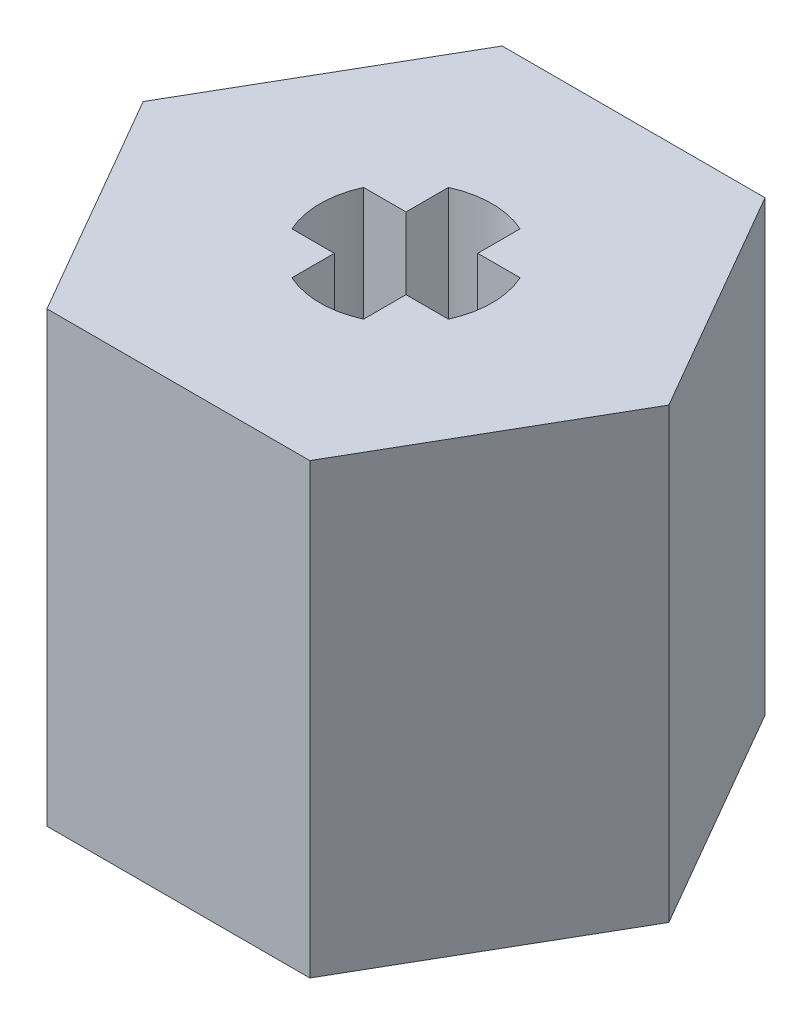
ISO-10303-21;
HEADER;
FILE_DESCRIPTION(('STEP AP214'),'2;1');
FILE_NAME('part.step','',(''),(''),'','','');
FILE_SCHEMA(('AUTOMOTIVE_DESIGN { 1 0 10303 214 1 1 1 1 }'));
ENDSEC;
DATA;
#1=APPLICATION_CONTEXT('core data for automotive mechanical design processes');
#2=APPLICATION_PROTOCOL_DEFINITION('international standard','automotive_design',2000,#1);
#3=PRODUCT_CONTEXT('',#1,'mechanical');
#4=PRODUCT('Part','Part','',(#3));
#5=PRODUCT_RELATED_PRODUCT_CATEGORY('part','',(#4));
#6=PRODUCT_DEFINITION_FORMATION('','',#4);
#7=PRODUCT_DEFINITION_CONTEXT('part definition',#1,'design');
#8=PRODUCT_DEFINITION('design','',#6,#7);
#9=PRODUCT_DEFINITION_SHAPE('','',#8);
#10=(LENGTH_UNIT() NAMED_UNIT(*) SI_UNIT(.MILLI.,.METRE.));
#11=(NAMED_UNIT(*) PLANE_ANGLE_UNIT() SI_UNIT($,.RADIAN.));
#12=(NAMED_UNIT(*) SI_UNIT($,.STERADIAN.) SOLID_ANGLE_UNIT());
#13=UNCERTAINTY_MEASURE_WITH_UNIT(LENGTH_MEASURE(1.E-05),#10,'distance_accuracy_value','');
#14=(GEOMETRIC_REPRESENTATION_CONTEXT(3) GLOBAL_UNCERTAINTY_ASSIGNED_CONTEXT((#13)) GLOBAL_UNIT_ASSIGNED_CONTEXT((#10,
#11,#12)) REPRESENTATION_CONTEXT('',''));
#15=CARTESIAN_POINT('',(0.,0.,0.));
#16=DIRECTION('',(0.,0.,1.));
#17=DIRECTION('',(1.,0.,0.));
#18=AXIS2_PLACEMENT_3D('',#15,#16,#17);
#19=CARTESIAN_POINT('',(0.,12.5,6.35));
#20=DIRECTION('',(0.,0.,-1.));
#21=DIRECTION('',(-1.,0.,0.));
#22=AXIS2_PLACEMENT_3D('',#19,#20,#21);
#23=PLANE('',#22);
#24=DIRECTION('',(1.,0.,0.));
#25=VECTOR('',#24,1.);
#26=CARTESIAN_POINT('',(0.,0.,6.35));
#27=LINE('',#26,#25);
#28=CARTESIAN_POINT('',(-3.66617420935412,0.,6.35));
#29=VERTEX_POINT('',#28);
#30=CARTESIAN_POINT('',(3.66617420935412,0.,6.35));
#31=VERTEX_POINT('',#30);
#32=EDGE_CURVE('E223',#29,#31,#27,.T.);
#33=ORIENTED_EDGE('',*,*,#32,.T.);
#34=DIRECTION('',(0.,-1.,0.));
#35=VECTOR('',#34,1.);
#36=CARTESIAN_POINT('',(3.66617420935412,12.5,6.35));
#37=LINE('',#36,#35);
#38=CARTESIAN_POINT('',(3.66617420935412,12.5,6.35));
#39=VERTEX_POINT('',#38);
#40=EDGE_CURVE('E11',#39,#31,#37,.T.);
#41=ORIENTED_EDGE('',*,*,#40,.F.);
#42=DIRECTION('',(1.,0.,0.));
#43=VECTOR('',#42,1.);
#44=CARTESIAN_POINT('',(0.,12.5,6.35));
#45=LINE('',#44,#43);
#46=CARTESIAN_POINT('',(-3.66617420935412,12.5,6.35));
#47=VERTEX_POINT('',#46);
#48=EDGE_CURVE('E315',#47,#39,#45,.T.);
#49=ORIENTED_EDGE('',*,*,#48,.F.);
#50=DIRECTION('',(0.,-1.,0.));
#51=VECTOR('',#50,1.);
#52=CARTESIAN_POINT('',(-3.66617420935412,12.5,6.35));
#53=LINE('',#52,#51);
#54=EDGE_CURVE('E234',#47,#29,#53,.T.);
#55=ORIENTED_EDGE('',*,*,#54,.T.);
#56=EDGE_LOOP('',(#33,#41,#49,#55));
#57=FACE_BOUND('',#56,.T.);
#58=ADVANCED_FACE('F33',(#57),#23,.F.);
#59=CARTESIAN_POINT('',(5.49926131403118,12.5,3.17499999999999));
#60=DIRECTION('',(-0.866025403784439,0.,-0.5));
#61=DIRECTION('',(-0.5,0.,0.866025403784439));
#62=AXIS2_PLACEMENT_3D('',#59,#60,#61);
#63=PLANE('',#62);
#64=DIRECTION('',(0.5,0.,-0.866025403784439));
#65=VECTOR('',#64,1.);
#66=CARTESIAN_POINT('',(5.49926131403118,0.,3.17499999999999));
#67=LINE('',#66,#65);
#68=CARTESIAN_POINT('',(7.33234841870824,0.,0.));
#69=VERTEX_POINT('',#68);
#70=EDGE_CURVE('E226',#31,#69,#67,.T.);
#71=ORIENTED_EDGE('',*,*,#70,.T.);
#72=DIRECTION('',(0.,-1.,0.));
#73=VECTOR('',#72,1.);
#74=CARTESIAN_POINT('',(7.33234841870824,12.5,0.));
#75=LINE('',#74,#73);
#76=CARTESIAN_POINT('',(7.33234841870824,12.5,0.));
#77=VERTEX_POINT('',#76);
#78=EDGE_CURVE('E43',#77,#69,#75,.T.);
#79=ORIENTED_EDGE('',*,*,#78,.F.);
#80=DIRECTION('',(0.5,0.,-0.866025403784439));
#81=VECTOR('',#80,1.);
#82=CARTESIAN_POINT('',(5.49926131403118,12.5,3.17499999999999));
#83=LINE('',#82,#81);
#84=EDGE_CURVE('E317',#39,#77,#83,.T.);
#85=ORIENTED_EDGE('',*,*,#84,.F.);
#86=ORIENTED_EDGE('',*,*,#40,.T.);
#87=EDGE_LOOP('',(#71,#79,#85,#86));
#88=FACE_BOUND('',#87,.T.);
#89=ADVANCED_FACE('F322',(#88),#63,.F.);
#90=CARTESIAN_POINT('',(5.49926131403118,12.5,-3.175));
#91=DIRECTION('',(-0.866025403784439,0.,0.5));
#92=DIRECTION('',(0.5,0.,0.866025403784439));
#93=AXIS2_PLACEMENT_3D('',#90,#91,#92);
#94=PLANE('',#93);
#95=DIRECTION('',(-0.5,0.,-0.866025403784439));
#96=VECTOR('',#95,1.);
#97=CARTESIAN_POINT('',(5.49926131403118,0.,-3.175));
#98=LINE('',#97,#96);
#99=CARTESIAN_POINT('',(3.66617420935411,0.,-6.35000000000001));
#100=VERTEX_POINT('',#99);
#101=EDGE_CURVE('E228',#69,#100,#98,.T.);
#102=ORIENTED_EDGE('',*,*,#101,.T.);
#103=DIRECTION('',(0.,-1.,0.));
#104=VECTOR('',#103,1.);
#105=CARTESIAN_POINT('',(3.66617420935411,12.5,-6.35000000000001));
#106=LINE('',#105,#104);
#107=CARTESIAN_POINT('',(3.66617420935411,12.5,-6.35000000000001));
#108=VERTEX_POINT('',#107);
#109=EDGE_CURVE('E184',#108,#100,#106,.T.);
#110=ORIENTED_EDGE('',*,*,#109,.F.);
#111=DIRECTION('',(-0.5,0.,-0.866025403784439));
#112=VECTOR('',#111,1.);
#113=CARTESIAN_POINT('',(5.49926131403118,12.5,-3.175));
#114=LINE('',#113,#112);
#115=EDGE_CURVE('E175',#77,#108,#114,.T.);
#116=ORIENTED_EDGE('',*,*,#115,.F.);
#117=ORIENTED_EDGE('',*,*,#78,.T.);
#118=EDGE_LOOP('',(#102,#110,#116,#117));
#119=FACE_BOUND('',#118,.T.);
#120=ADVANCED_FACE('F325',(#119),#94,.F.);
#121=CARTESIAN_POINT('',(0.,12.5,-6.35000000000001));
#122=DIRECTION('',(0.,0.,1.));
#123=DIRECTION('',(1.,0.,0.));
#124=AXIS2_PLACEMENT_3D('',#121,#122,#123);
#125=PLANE('',#124);
#126=DIRECTION('',(-1.,0.,0.));
#127=VECTOR('',#126,1.);
#128=CARTESIAN_POINT('',(0.,0.,-6.35000000000001));
#129=LINE('',#128,#127);
#130=CARTESIAN_POINT('',(-3.66617420935412,0.,-6.35000000000001));
#131=VERTEX_POINT('',#130);
#132=EDGE_CURVE('E183',#100,#131,#129,.T.);
#133=ORIENTED_EDGE('',*,*,#132,.T.);
#134=DIRECTION('',(0.,-1.,0.));
#135=VECTOR('',#134,1.);
#136=CARTESIAN_POINT('',(-3.66617420935412,12.5,-6.35000000000001));
#137=LINE('',#136,#135);
#138=CARTESIAN_POINT('',(-3.66617420935412,12.5,-6.35000000000001));
#139=VERTEX_POINT('',#138);
#140=EDGE_CURVE('E180',#139,#131,#137,.T.);
#141=ORIENTED_EDGE('',*,*,#140,.F.);
#142=DIRECTION('',(-1.,0.,0.));
#143=VECTOR('',#142,1.);
#144=CARTESIAN_POINT('',(0.,12.5,-6.35000000000001));
#145=LINE('',#144,#143);
#146=EDGE_CURVE('E169',#108,#139,#145,.T.);
#147=ORIENTED_EDGE('',*,*,#146,.F.);
#148=ORIENTED_EDGE('',*,*,#109,.T.);
#149=EDGE_LOOP('',(#133,#141,#147,#148));
#150=FACE_BOUND('',#149,.T.);
#151=ADVANCED_FACE('F181',(#150),#125,.F.);
#152=CARTESIAN_POINT('',(-5.49926131403119,12.5,-3.175));
#153=DIRECTION('',(0.866025403784439,0.,0.5));
#154=DIRECTION('',(0.5,0.,-0.866025403784439));
#155=AXIS2_PLACEMENT_3D('',#152,#153,#154);
#156=PLANE('',#155);
#157=DIRECTION('',(-0.5,0.,0.866025403784439));
#158=VECTOR('',#157,1.);
#159=CARTESIAN_POINT('',(-5.49926131403119,0.,-3.175));
#160=LINE('',#159,#158);
#161=CARTESIAN_POINT('',(-7.33234841870824,0.,0.));
#162=VERTEX_POINT('',#161);
#163=EDGE_CURVE('E111',#131,#162,#160,.T.);
#164=ORIENTED_EDGE('',*,*,#163,.T.);
#165=DIRECTION('',(0.,-1.,0.));
#166=VECTOR('',#165,1.);
#167=CARTESIAN_POINT('',(-7.33234841870824,12.5,0.));
#168=LINE('',#167,#166);
#169=CARTESIAN_POINT('',(-7.33234841870824,12.5,0.));
#170=VERTEX_POINT('',#169);
#171=EDGE_CURVE('E185',#170,#162,#168,.T.);
#172=ORIENTED_EDGE('',*,*,#171,.F.);
#173=DIRECTION('',(-0.5,0.,0.866025403784439));
#174=VECTOR('',#173,1.);
#175=CARTESIAN_POINT('',(-5.49926131403119,12.5,-3.175));
#176=LINE('',#175,#174);
#177=EDGE_CURVE('E173',#139,#170,#176,.T.);
#178=ORIENTED_EDGE('',*,*,#177,.F.);
#179=ORIENTED_EDGE('',*,*,#140,.T.);
#180=EDGE_LOOP('',(#164,#172,#178,#179));
#181=FACE_BOUND('',#180,.T.);
#182=ADVANCED_FACE('F187',(#181),#156,.F.);
#183=CARTESIAN_POINT('',(0.,12.5,0.));
#184=DIRECTION('',(0.,-1.,0.));
#185=DIRECTION('',(0.,0.,-1.));
#186=AXIS2_PLACEMENT_3D('',#183,#184,#185);
#187=CYLINDRICAL_SURFACE('',#186,2.4);
#188=CARTESIAN_POINT('',(0.,0.,0.));
#189=DIRECTION('',(0.,1.,0.));
#190=DIRECTION('',(0.,0.,1.));
#191=AXIS2_PLACEMENT_3D('',#188,#189,#190);
#192=CIRCLE('',#191,2.4);
#193=CARTESIAN_POINT('',(-1.,0.,2.18174242292714));
#194=VERTEX_POINT('',#193);
#195=CARTESIAN_POINT('',(1.,0.,2.18174242292714));
#196=VERTEX_POINT('',#195);
#197=EDGE_CURVE('E193',#194,#196,#192,.T.);
#198=ORIENTED_EDGE('',*,*,#197,.F.);
#199=DIRECTION('',(0.,-1.,0.));
#200=VECTOR('',#199,1.);
#201=CARTESIAN_POINT('',(-1.,12.5,2.18174242292714));
#202=LINE('',#201,#200);
#203=CARTESIAN_POINT('',(-1.,12.5,2.18174242292714));
#204=VERTEX_POINT('',#203);
#205=EDGE_CURVE('E37',#204,#194,#202,.T.);
#206=ORIENTED_EDGE('',*,*,#205,.F.);
#207=CARTESIAN_POINT('',(0.,12.5,0.));
#208=DIRECTION('',(0.,1.,0.));
#209=DIRECTION('',(0.,0.,1.));
#210=AXIS2_PLACEMENT_3D('',#207,#208,#209);
#211=CIRCLE('',#210,2.4);
#212=CARTESIAN_POINT('',(1.,12.5,2.18174242292714));
#213=VERTEX_POINT('',#212);
#214=EDGE_CURVE('E233',#204,#213,#211,.T.);
#215=ORIENTED_EDGE('',*,*,#214,.T.);
#216=DIRECTION('',(0.,-1.,0.));
#217=VECTOR('',#216,1.);
#218=CARTESIAN_POINT('',(1.,12.5,2.18174242292714));
#219=LINE('',#218,#217);
#220=EDGE_CURVE('E189',#213,#196,#219,.T.);
#221=ORIENTED_EDGE('',*,*,#220,.T.);
#222=EDGE_LOOP('',(#198,#206,#215,#221));
#223=FACE_BOUND('',#222,.T.);
#224=ADVANCED_FACE('F267',(#223),#187,.F.);
#225=CARTESIAN_POINT('',(-1.,12.5,0.));
#226=DIRECTION('',(1.,0.,0.));
#227=DIRECTION('',(0.,0.,-1.));
#228=AXIS2_PLACEMENT_3D('',#225,#226,#227);
#229=PLANE('',#228);
#230=DIRECTION('',(0.,0.,1.));
#231=VECTOR('',#230,1.);
#232=CARTESIAN_POINT('',(-1.,0.,0.));
#233=LINE('',#232,#231);
#234=CARTESIAN_POINT('',(-1.,0.,1.));
#235=VERTEX_POINT('',#234);
#236=EDGE_CURVE('E196',#235,#194,#233,.T.);
#237=ORIENTED_EDGE('',*,*,#236,.F.);
#238=DIRECTION('',(0.,-1.,0.));
#239=VECTOR('',#238,1.);
#240=CARTESIAN_POINT('',(-1.,12.5,1.));
#241=LINE('',#240,#239);
#242=CARTESIAN_POINT('',(-1.,12.5,1.));
#243=VERTEX_POINT('',#242);
#244=EDGE_CURVE('E258',#243,#235,#241,.T.);
#245=ORIENTED_EDGE('',*,*,#244,.F.);
#246=DIRECTION('',(0.,0.,1.));
#247=VECTOR('',#246,1.);
#248=CARTESIAN_POINT('',(-1.,12.5,0.));
#249=LINE('',#248,#247);
#250=EDGE_CURVE('E266',#243,#204,#249,.T.);
#251=ORIENTED_EDGE('',*,*,#250,.T.);
#252=ORIENTED_EDGE('',*,*,#205,.T.);
#253=EDGE_LOOP('',(#237,#245,#251,#252));
#254=FACE_BOUND('',#253,.T.);
#255=ADVANCED_FACE('F35',(#254),#229,.T.);
#256=CARTESIAN_POINT('',(0.,12.5,1.));
#257=DIRECTION('',(0.,0.,1.));
#258=DIRECTION('',(1.,0.,0.));
#259=AXIS2_PLACEMENT_3D('',#256,#257,#258);
#260=PLANE('',#259);
#261=DIRECTION('',(-1.,0.,0.));
#262=VECTOR('',#261,1.);
#263=CARTESIAN_POINT('',(0.,0.,1.));
#264=LINE('',#263,#262);
#265=CARTESIAN_POINT('',(-2.18174242292714,0.,1.));
#266=VERTEX_POINT('',#265);
#267=EDGE_CURVE('E201',#235,#266,#264,.T.);
#268=ORIENTED_EDGE('',*,*,#267,.T.);
#269=DIRECTION('',(0.,-1.,0.));
#270=VECTOR('',#269,1.);
#271=CARTESIAN_POINT('',(-2.18174242292714,12.5,1.));
#272=LINE('',#271,#270);
#273=CARTESIAN_POINT('',(-2.18174242292714,12.5,1.));
#274=VERTEX_POINT('',#273);
#275=EDGE_CURVE('E257',#274,#266,#272,.T.);
#276=ORIENTED_EDGE('',*,*,#275,.F.);
#277=DIRECTION('',(-1.,0.,0.));
#278=VECTOR('',#277,1.);
#279=CARTESIAN_POINT('',(0.,12.5,1.));
#280=LINE('',#279,#278);
#281=EDGE_CURVE('E278',#243,#274,#280,.T.);
#282=ORIENTED_EDGE('',*,*,#281,.F.);
#283=ORIENTED_EDGE('',*,*,#244,.T.);
#284=EDGE_LOOP('',(#268,#276,#282,#283));
#285=FACE_BOUND('',#284,.T.);
#286=ADVANCED_FACE('F276',(#285),#260,.F.);
#287=CARTESIAN_POINT('',(-2.18174242292714,0.,-1.));
#288=VERTEX_POINT('',#287);
#289=EDGE_CURVE('E198',#288,#266,#192,.T.);
#290=ORIENTED_EDGE('',*,*,#289,.F.);
#291=DIRECTION('',(0.,-1.,0.));
#292=VECTOR('',#291,1.);
#293=CARTESIAN_POINT('',(-2.18174242292714,12.5,-1.));
#294=LINE('',#293,#292);
#295=CARTESIAN_POINT('',(-2.18174242292714,12.5,-1.));
#296=VERTEX_POINT('',#295);
#297=EDGE_CURVE('E255',#296,#288,#294,.T.);
#298=ORIENTED_EDGE('',*,*,#297,.F.);
#299=EDGE_CURVE('E281',#296,#274,#211,.T.);
#300=ORIENTED_EDGE('',*,*,#299,.T.);
#301=ORIENTED_EDGE('',*,*,#275,.T.);
#302=EDGE_LOOP('',(#290,#298,#300,#301));
#303=FACE_BOUND('',#302,.T.);
#304=ADVANCED_FACE('F282',(#303),#187,.F.);
#305=CARTESIAN_POINT('',(0.,12.5,-1.));
#306=DIRECTION('',(0.,0.,1.));
#307=DIRECTION('',(1.,0.,0.));
#308=AXIS2_PLACEMENT_3D('',#305,#306,#307);
#309=PLANE('',#308);
#310=DIRECTION('',(-1.,0.,0.));
#311=VECTOR('',#310,1.);
#312=CARTESIAN_POINT('',(0.,0.,-1.));
#313=LINE('',#312,#311);
#314=CARTESIAN_POINT('',(-1.,0.,-1.));
#315=VERTEX_POINT('',#314);
#316=EDGE_CURVE('E204',#315,#288,#313,.T.);
#317=ORIENTED_EDGE('',*,*,#316,.F.);
#318=DIRECTION('',(0.,-1.,0.));
#319=VECTOR('',#318,1.);
#320=CARTESIAN_POINT('',(-1.,12.5,-1.));
#321=LINE('',#320,#319);
#322=CARTESIAN_POINT('',(-1.,12.5,-1.));
#323=VERTEX_POINT('',#322);
#324=EDGE_CURVE('E253',#323,#315,#321,.T.);
#325=ORIENTED_EDGE('',*,*,#324,.F.);
#326=DIRECTION('',(-1.,0.,0.));
#327=VECTOR('',#326,1.);
#328=CARTESIAN_POINT('',(0.,12.5,-1.));
#329=LINE('',#328,#327);
#330=EDGE_CURVE('E286',#323,#296,#329,.T.);
#331=ORIENTED_EDGE('',*,*,#330,.T.);
#332=ORIENTED_EDGE('',*,*,#297,.T.);
#333=EDGE_LOOP('',(#317,#325,#331,#332));
#334=FACE_BOUND('',#333,.T.);
#335=ADVANCED_FACE('F368',(#334),#309,.T.);
#336=CARTESIAN_POINT('',(-1.,12.5,0.));
#337=DIRECTION('',(-1.,0.,0.));
#338=DIRECTION('',(0.,0.,1.));
#339=AXIS2_PLACEMENT_3D('',#336,#337,#338);
#340=PLANE('',#339);
#341=DIRECTION('',(0.,0.,-1.));
#342=VECTOR('',#341,1.);
#343=CARTESIAN_POINT('',(-1.,0.,0.));
#344=LINE('',#343,#342);
#345=CARTESIAN_POINT('',(-1.,0.,-2.18174242292714));
#346=VERTEX_POINT('',#345);
#347=EDGE_CURVE('E207',#315,#346,#344,.T.);
#348=ORIENTED_EDGE('',*,*,#347,.T.);
#349=DIRECTION('',(0.,-1.,0.));
#350=VECTOR('',#349,1.);
#351=CARTESIAN_POINT('',(-1.,12.5,-2.18174242292714));
#352=LINE('',#351,#350);
#353=CARTESIAN_POINT('',(-1.,12.5,-2.18174242292714));
#354=VERTEX_POINT('',#353);
#355=EDGE_CURVE('E251',#354,#346,#352,.T.);
#356=ORIENTED_EDGE('',*,*,#355,.F.);
#357=DIRECTION('',(0.,0.,-1.));
#358=VECTOR('',#357,1.);
#359=CARTESIAN_POINT('',(-1.,12.5,0.));
#360=LINE('',#359,#358);
#361=EDGE_CURVE('E289',#323,#354,#360,.T.);
#362=ORIENTED_EDGE('',*,*,#361,.F.);
#363=ORIENTED_EDGE('',*,*,#324,.T.);
#364=EDGE_LOOP('',(#348,#356,#362,#363));
#365=FACE_BOUND('',#364,.T.);
#366=ADVANCED_FACE('F365',(#365),#340,.F.);
#367=CARTESIAN_POINT('',(1.,0.,-2.18174242292714));
#368=VERTEX_POINT('',#367);
#369=EDGE_CURVE('E210',#368,#346,#192,.T.);
#370=ORIENTED_EDGE('',*,*,#369,.F.);
#371=DIRECTION('',(0.,-1.,0.));
#372=VECTOR('',#371,1.);
#373=CARTESIAN_POINT('',(1.,12.5,-2.18174242292714));
#374=LINE('',#373,#372);
#375=CARTESIAN_POINT('',(1.,12.5,-2.18174242292714));
#376=VERTEX_POINT('',#375);
#377=EDGE_CURVE('E249',#376,#368,#374,.T.);
#378=ORIENTED_EDGE('',*,*,#377,.F.);
#379=EDGE_CURVE('E288',#376,#354,#211,.T.);
#380=ORIENTED_EDGE('',*,*,#379,.T.);
#381=ORIENTED_EDGE('',*,*,#355,.T.);
#382=EDGE_LOOP('',(#370,#378,#380,#381));
#383=FACE_BOUND('',#382,.T.);
#384=ADVANCED_FACE('F357',(#383),#187,.F.);
#385=CARTESIAN_POINT('',(1.,12.5,0.));
#386=DIRECTION('',(-1.,0.,0.));
#387=DIRECTION('',(0.,0.,1.));
#388=AXIS2_PLACEMENT_3D('',#385,#386,#387);
#389=PLANE('',#388);
#390=DIRECTION('',(0.,0.,-1.));
#391=VECTOR('',#390,1.);
#392=CARTESIAN_POINT('',(1.,0.,0.));
#393=LINE('',#392,#391);
#394=CARTESIAN_POINT('',(1.,0.,-1.));
#395=VERTEX_POINT('',#394);
#396=EDGE_CURVE('E211',#395,#368,#393,.T.);
#397=ORIENTED_EDGE('',*,*,#396,.F.);
#398=DIRECTION('',(0.,-1.,0.));
#399=VECTOR('',#398,1.);
#400=CARTESIAN_POINT('',(1.,12.5,-1.));
#401=LINE('',#400,#399);
#402=CARTESIAN_POINT('',(1.,12.5,-1.));
#403=VERTEX_POINT('',#402);
#404=EDGE_CURVE('E247',#403,#395,#401,.T.);
#405=ORIENTED_EDGE('',*,*,#404,.F.);
#406=DIRECTION('',(0.,0.,-1.));
#407=VECTOR('',#406,1.);
#408=CARTESIAN_POINT('',(1.,12.5,0.));
#409=LINE('',#408,#407);
#410=EDGE_CURVE('E295',#403,#376,#409,.T.);
#411=ORIENTED_EDGE('',*,*,#410,.T.);
#412=ORIENTED_EDGE('',*,*,#377,.T.);
#413=EDGE_LOOP('',(#397,#405,#411,#412));
#414=FACE_BOUND('',#413,.T.);
#415=ADVANCED_FACE('F360',(#414),#389,.T.);
#416=CARTESIAN_POINT('',(0.,12.5,-1.));
#417=DIRECTION('',(0.,0.,-1.));
#418=DIRECTION('',(-1.,0.,0.));
#419=AXIS2_PLACEMENT_3D('',#416,#417,#418);
#420=PLANE('',#419);
#421=DIRECTION('',(1.,0.,0.));
#422=VECTOR('',#421,1.);
#423=CARTESIAN_POINT('',(0.,0.,-1.));
#424=LINE('',#423,#422);
#425=CARTESIAN_POINT('',(2.18174242292714,0.,-1.));
#426=VERTEX_POINT('',#425);
#427=EDGE_CURVE('E214',#395,#426,#424,.T.);
#428=ORIENTED_EDGE('',*,*,#427,.T.);
#429=DIRECTION('',(0.,-1.,0.));
#430=VECTOR('',#429,1.);
#431=CARTESIAN_POINT('',(2.18174242292714,12.5,-1.));
#432=LINE('',#431,#430);
#433=CARTESIAN_POINT('',(2.18174242292714,12.5,-1.));
#434=VERTEX_POINT('',#433);
#435=EDGE_CURVE('E245',#434,#426,#432,.T.);
#436=ORIENTED_EDGE('',*,*,#435,.F.);
#437=DIRECTION('',(1.,0.,0.));
#438=VECTOR('',#437,1.);
#439=CARTESIAN_POINT('',(0.,12.5,-1.));
#440=LINE('',#439,#438);
#441=EDGE_CURVE('E299',#403,#434,#440,.T.);
#442=ORIENTED_EDGE('',*,*,#441,.F.);
#443=ORIENTED_EDGE('',*,*,#404,.T.);
#444=EDGE_LOOP('',(#428,#436,#442,#443));
#445=FACE_BOUND('',#444,.T.);
#446=ADVANCED_FACE('F356',(#445),#420,.F.);
#447=CARTESIAN_POINT('',(2.18174242292714,0.,1.));
#448=VERTEX_POINT('',#447);
#449=EDGE_CURVE('E197',#448,#426,#192,.T.);
#450=ORIENTED_EDGE('',*,*,#449,.F.);
#451=DIRECTION('',(0.,-1.,0.));
#452=VECTOR('',#451,1.);
#453=CARTESIAN_POINT('',(2.18174242292714,12.5,1.));
#454=LINE('',#453,#452);
#455=CARTESIAN_POINT('',(2.18174242292714,12.5,1.));
#456=VERTEX_POINT('',#455);
#457=EDGE_CURVE('E243',#456,#448,#454,.T.);
#458=ORIENTED_EDGE('',*,*,#457,.F.);
#459=EDGE_CURVE('E293',#456,#434,#211,.T.);
#460=ORIENTED_EDGE('',*,*,#459,.T.);
#461=ORIENTED_EDGE('',*,*,#435,.T.);
#462=EDGE_LOOP('',(#450,#458,#460,#461));
#463=FACE_BOUND('',#462,.T.);
#464=ADVANCED_FACE('F352',(#463),#187,.F.);
#465=CARTESIAN_POINT('',(0.,12.5,1.));
#466=DIRECTION('',(0.,0.,-1.));
#467=DIRECTION('',(-1.,0.,0.));
#468=AXIS2_PLACEMENT_3D('',#465,#466,#467);
#469=PLANE('',#468);
#470=DIRECTION('',(1.,0.,0.));
#471=VECTOR('',#470,1.);
#472=CARTESIAN_POINT('',(0.,0.,1.));
#473=LINE('',#472,#471);
#474=CARTESIAN_POINT('',(1.,0.,1.));
#475=VERTEX_POINT('',#474);
#476=EDGE_CURVE('E217',#475,#448,#473,.T.);
#477=ORIENTED_EDGE('',*,*,#476,.F.);
#478=DIRECTION('',(0.,-1.,0.));
#479=VECTOR('',#478,1.);
#480=CARTESIAN_POINT('',(1.,12.5,1.));
#481=LINE('',#480,#479);
#482=CARTESIAN_POINT('',(1.,12.5,1.));
#483=VERTEX_POINT('',#482);
#484=EDGE_CURVE('E241',#483,#475,#481,.T.);
#485=ORIENTED_EDGE('',*,*,#484,.F.);
#486=DIRECTION('',(1.,0.,0.));
#487=VECTOR('',#486,1.);
#488=CARTESIAN_POINT('',(0.,12.5,1.));
#489=LINE('',#488,#487);
#490=EDGE_CURVE('E303',#483,#456,#489,.T.);
#491=ORIENTED_EDGE('',*,*,#490,.T.);
#492=ORIENTED_EDGE('',*,*,#457,.T.);
#493=EDGE_LOOP('',(#477,#485,#491,#492));
#494=FACE_BOUND('',#493,.T.);
#495=ADVANCED_FACE('F337',(#494),#469,.T.);
#496=CARTESIAN_POINT('',(1.,12.5,0.));
#497=DIRECTION('',(1.,0.,0.));
#498=DIRECTION('',(0.,0.,-1.));
#499=AXIS2_PLACEMENT_3D('',#496,#497,#498);
#500=PLANE('',#499);
#501=DIRECTION('',(0.,0.,1.));
#502=VECTOR('',#501,1.);
#503=CARTESIAN_POINT('',(1.,0.,0.));
#504=LINE('',#503,#502);
#505=EDGE_CURVE('E220',#475,#196,#504,.T.);
#506=ORIENTED_EDGE('',*,*,#505,.T.);
#507=ORIENTED_EDGE('',*,*,#220,.F.);
#508=DIRECTION('',(0.,0.,1.));
#509=VECTOR('',#508,1.);
#510=CARTESIAN_POINT('',(1.,12.5,0.));
#511=LINE('',#510,#509);
#512=EDGE_CURVE('E307',#483,#213,#511,.T.);
#513=ORIENTED_EDGE('',*,*,#512,.F.);
#514=ORIENTED_EDGE('',*,*,#484,.T.);
#515=EDGE_LOOP('',(#506,#507,#513,#514));
#516=FACE_BOUND('',#515,.T.);
#517=ADVANCED_FACE('F330',(#516),#500,.F.);
#518=CARTESIAN_POINT('',(-5.49926131403119,12.5,3.175));
#519=DIRECTION('',(0.866025403784439,0.,-0.5));
#520=DIRECTION('',(-0.5,0.,-0.866025403784439));
#521=AXIS2_PLACEMENT_3D('',#518,#519,#520);
#522=PLANE('',#521);
#523=DIRECTION('',(0.5,0.,0.866025403784439));
#524=VECTOR('',#523,1.);
#525=CARTESIAN_POINT('',(-5.49926131403119,0.,3.175));
#526=LINE('',#525,#524);
#527=EDGE_CURVE('E117',#162,#29,#526,.T.);
#528=ORIENTED_EDGE('',*,*,#527,.T.);
#529=ORIENTED_EDGE('',*,*,#54,.F.);
#530=DIRECTION('',(0.5,0.,0.866025403784439));
#531=VECTOR('',#530,1.);
#532=CARTESIAN_POINT('',(-5.49926131403119,12.5,3.175));
#533=LINE('',#532,#531);
#534=EDGE_CURVE('E52',#170,#47,#533,.T.);
#535=ORIENTED_EDGE('',*,*,#534,.F.);
#536=ORIENTED_EDGE('',*,*,#171,.T.);
#537=EDGE_LOOP('',(#528,#529,#535,#536));
#538=FACE_BOUND('',#537,.T.);
#539=ADVANCED_FACE('F328',(#538),#522,.F.);
#540=CARTESIAN_POINT('',(0.,12.5,0.));
#541=DIRECTION('',(0.,1.,0.));
#542=DIRECTION('',(0.,0.,1.));
#543=AXIS2_PLACEMENT_3D('',#540,#541,#542);
#544=PLANE('',#543);
#545=ORIENTED_EDGE('',*,*,#214,.F.);
#546=ORIENTED_EDGE('',*,*,#250,.F.);
#547=ORIENTED_EDGE('',*,*,#281,.T.);
#548=ORIENTED_EDGE('',*,*,#299,.F.);
#549=ORIENTED_EDGE('',*,*,#330,.F.);
#550=ORIENTED_EDGE('',*,*,#361,.T.);
#551=ORIENTED_EDGE('',*,*,#379,.F.);
#552=ORIENTED_EDGE('',*,*,#410,.F.);
#553=ORIENTED_EDGE('',*,*,#441,.T.);
#554=ORIENTED_EDGE('',*,*,#459,.F.);
#555=ORIENTED_EDGE('',*,*,#490,.F.);
#556=ORIENTED_EDGE('',*,*,#512,.T.);
#557=EDGE_LOOP('',(#545,#546,#547,#548,#549,#550,#551,#552,#553,#554,#555,#556));
#558=FACE_BOUND('',#557,.T.);
#559=ORIENTED_EDGE('',*,*,#48,.T.);
#560=ORIENTED_EDGE('',*,*,#84,.T.);
#561=ORIENTED_EDGE('',*,*,#115,.T.);
#562=ORIENTED_EDGE('',*,*,#146,.T.);
#563=ORIENTED_EDGE('',*,*,#177,.T.);
#564=ORIENTED_EDGE('',*,*,#534,.T.);
#565=EDGE_LOOP('',(#559,#560,#561,#562,#563,#564));
#566=FACE_BOUND('',#565,.T.);
#567=ADVANCED_FACE('F171',(#558,#566),#544,.T.);
#568=CARTESIAN_POINT('',(0.,0.,0.));
#569=DIRECTION('',(0.,1.,0.));
#570=DIRECTION('',(0.,0.,1.));
#571=AXIS2_PLACEMENT_3D('',#568,#569,#570);
#572=PLANE('',#571);
#573=ORIENTED_EDGE('',*,*,#197,.T.);
#574=ORIENTED_EDGE('',*,*,#505,.F.);
#575=ORIENTED_EDGE('',*,*,#476,.T.);
#576=ORIENTED_EDGE('',*,*,#449,.T.);
#577=ORIENTED_EDGE('',*,*,#427,.F.);
#578=ORIENTED_EDGE('',*,*,#396,.T.);
#579=ORIENTED_EDGE('',*,*,#369,.T.);
#580=ORIENTED_EDGE('',*,*,#347,.F.);
#581=ORIENTED_EDGE('',*,*,#316,.T.);
#582=ORIENTED_EDGE('',*,*,#289,.T.);
#583=ORIENTED_EDGE('',*,*,#267,.F.);
#584=ORIENTED_EDGE('',*,*,#236,.T.);
#585=EDGE_LOOP('',(#573,#574,#575,#576,#577,#578,#579,#580,#581,#582,#583,#584));
#586=FACE_BOUND('',#585,.T.);
#587=ORIENTED_EDGE('',*,*,#32,.F.);
#588=ORIENTED_EDGE('',*,*,#527,.F.);
#589=ORIENTED_EDGE('',*,*,#163,.F.);
#590=ORIENTED_EDGE('',*,*,#132,.F.);
#591=ORIENTED_EDGE('',*,*,#101,.F.);
#592=ORIENTED_EDGE('',*,*,#70,.F.);
#593=EDGE_LOOP('',(#587,#588,#589,#590,#591,#592));
#594=FACE_BOUND('',#593,.T.);
#595=ADVANCED_FACE('F271',(#586,#594),#572,.F.);
#596=CLOSED_SHELL('',(#58,#89,#120,#151,#182,#224,#255,#286,#304,#335,#366,#384,#415,#446,#464,
#495,#517,#539,#567,#595));
#597=MANIFOLD_SOLID_BREP('B2',#596);
#598=ADVANCED_BREP_SHAPE_REPRESENTATION('',(#18,#597),#14);
#599=SHAPE_DEFINITION_REPRESENTATION(#9,#598);
ENDSEC;
END-ISO-10303-21;
